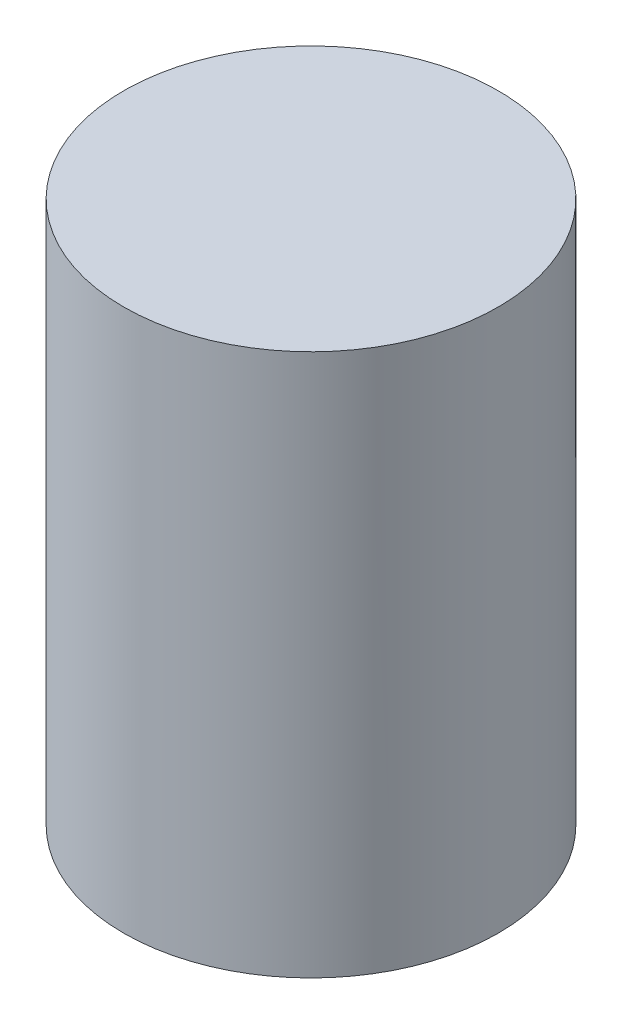
ISO-10303-21;
HEADER;
FILE_DESCRIPTION(('STEP AP214'),'2;1');
FILE_NAME('part.step','',(''),(''),'','','');
FILE_SCHEMA(('AUTOMOTIVE_DESIGN { 1 0 10303 214 1 1 1 1 }'));
ENDSEC;
DATA;
#1=APPLICATION_CONTEXT('core data for automotive mechanical design processes');
#2=APPLICATION_PROTOCOL_DEFINITION('international standard','automotive_design',2000,#1);
#3=PRODUCT_CONTEXT('',#1,'mechanical');
#4=PRODUCT('Part','Part','',(#3));
#5=PRODUCT_RELATED_PRODUCT_CATEGORY('part','',(#4));
#6=PRODUCT_DEFINITION_FORMATION('','',#4);
#7=PRODUCT_DEFINITION_CONTEXT('part definition',#1,'design');
#8=PRODUCT_DEFINITION('design','',#6,#7);
#9=PRODUCT_DEFINITION_SHAPE('','',#8);
#10=(LENGTH_UNIT() NAMED_UNIT(*) SI_UNIT(.MILLI.,.METRE.));
#11=(NAMED_UNIT(*) PLANE_ANGLE_UNIT() SI_UNIT($,.RADIAN.));
#12=(NAMED_UNIT(*) SI_UNIT($,.STERADIAN.) SOLID_ANGLE_UNIT());
#13=UNCERTAINTY_MEASURE_WITH_UNIT(LENGTH_MEASURE(1.E-05),#10,'distance_accuracy_value','');
#14=(GEOMETRIC_REPRESENTATION_CONTEXT(3) GLOBAL_UNCERTAINTY_ASSIGNED_CONTEXT((#13)) GLOBAL_UNIT_ASSIGNED_CONTEXT((#10,
#11,#12)) REPRESENTATION_CONTEXT('',''));
#15=CARTESIAN_POINT('',(0.,0.,0.));
#16=DIRECTION('',(0.,0.,1.));
#17=DIRECTION('',(1.,0.,0.));
#18=AXIS2_PLACEMENT_3D('',#15,#16,#17);
#19=CARTESIAN_POINT('',(-44.6486526099794,34.352732717656,0.));
#20=DIRECTION('',(0.,1.,0.));
#21=DIRECTION('',(0.,0.,1.));
#22=AXIS2_PLACEMENT_3D('',#19,#20,#21);
#23=PLANE('',#22);
#24=CARTESIAN_POINT('',(0.,34.352732717656,0.));
#25=DIRECTION('',(0.,1.,0.));
#26=DIRECTION('',(0.,0.,1.));
#27=AXIS2_PLACEMENT_3D('',#24,#25,#26);
#28=CIRCLE('',#27,25.5758649235016);
#29=CARTESIAN_POINT('',(0.,34.352732717656,25.5758649235016));
#30=VERTEX_POINT('',#29);
#31=EDGE_CURVE('E42',#30,#30,#28,.F.);
#32=ORIENTED_EDGE('',*,*,#31,.F.);
#33=EDGE_LOOP('',(#32));
#34=FACE_BOUND('',#33,.T.);
#35=ADVANCED_FACE('F41',(#34),#23,.T.);
#36=CARTESIAN_POINT('',(0.,0.,0.));
#37=DIRECTION('',(0.,1.,0.));
#38=DIRECTION('',(0.,0.,1.));
#39=AXIS2_PLACEMENT_3D('',#36,#37,#38);
#40=CYLINDRICAL_SURFACE('',#39,25.5758649235016);
#41=ORIENTED_EDGE('',*,*,#31,.T.);
#42=EDGE_LOOP('',(#41));
#43=FACE_BOUND('',#42,.T.);
#44=CARTESIAN_POINT('',(0.,-39.6986911232854,0.));
#45=DIRECTION('',(0.,-1.,0.));
#46=DIRECTION('',(0.,0.,-1.));
#47=AXIS2_PLACEMENT_3D('',#44,#45,#46);
#48=CIRCLE('',#47,25.5758649235016);
#49=CARTESIAN_POINT('',(0.,-39.6986911232854,-25.5758649235016));
#50=VERTEX_POINT('',#49);
#51=EDGE_CURVE('E10',#50,#50,#48,.T.);
#52=ORIENTED_EDGE('',*,*,#51,.F.);
#53=EDGE_LOOP('',(#52));
#54=FACE_BOUND('',#53,.T.);
#55=ADVANCED_FACE('F63',(#43,#54),#40,.T.);
#56=CARTESIAN_POINT('',(-44.6486526099794,-39.6986911232854,0.));
#57=DIRECTION('',(0.,-1.,0.));
#58=DIRECTION('',(0.,0.,-1.));
#59=AXIS2_PLACEMENT_3D('',#56,#57,#58);
#60=PLANE('',#59);
#61=ORIENTED_EDGE('',*,*,#51,.T.);
#62=EDGE_LOOP('',(#61));
#63=FACE_BOUND('',#62,.T.);
#64=ADVANCED_FACE('F69',(#63),#60,.T.);
#65=CLOSED_SHELL('',(#35,#55,#64));
#66=MANIFOLD_SOLID_BREP('B2',#65);
#67=ADVANCED_BREP_SHAPE_REPRESENTATION('',(#18,#66),#14);
#68=SHAPE_DEFINITION_REPRESENTATION(#9,#67);
ENDSEC;
END-ISO-10303-21;
